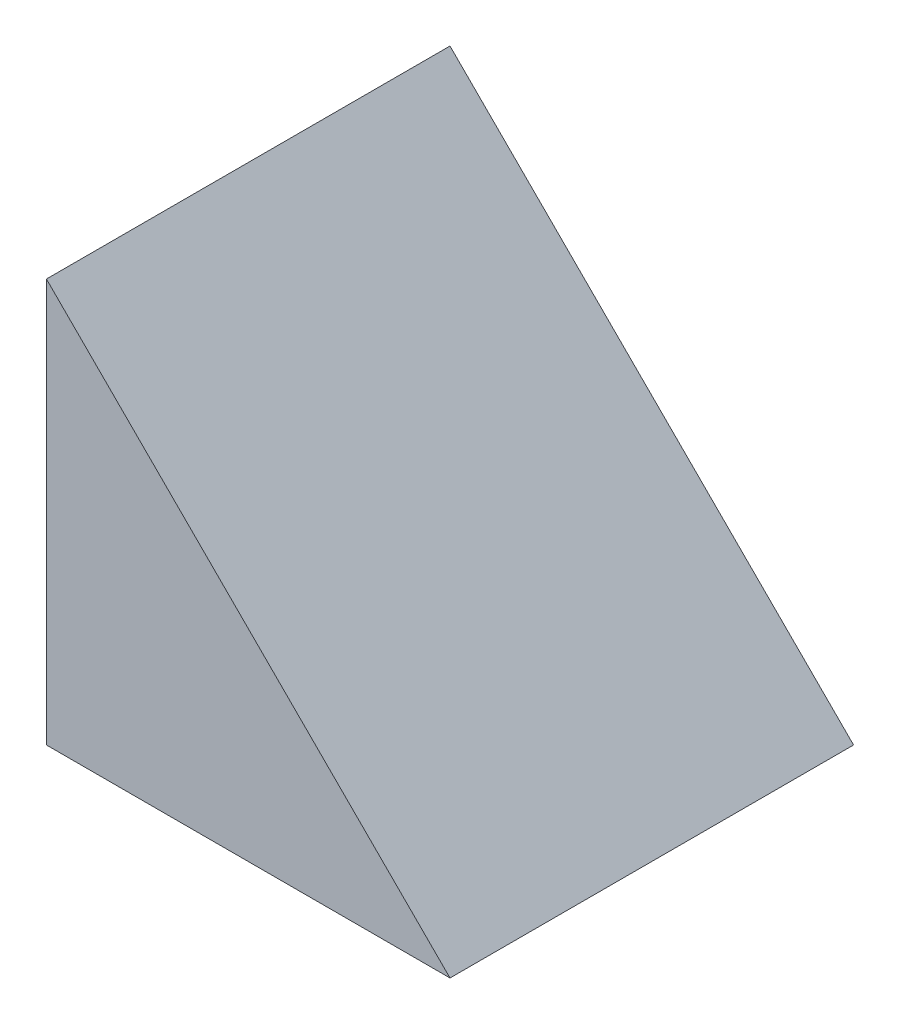
ISO-10303-21;
HEADER;
FILE_DESCRIPTION(('STEP AP214'),'2;1');
FILE_NAME('part.step','',(''),(''),'','','');
FILE_SCHEMA(('AUTOMOTIVE_DESIGN { 1 0 10303 214 1 1 1 1 }'));
ENDSEC;
DATA;
#1=APPLICATION_CONTEXT('core data for automotive mechanical design processes');
#2=APPLICATION_PROTOCOL_DEFINITION('international standard','automotive_design',2000,#1);
#3=PRODUCT_CONTEXT('',#1,'mechanical');
#4=PRODUCT('Part','Part','',(#3));
#5=PRODUCT_RELATED_PRODUCT_CATEGORY('part','',(#4));
#6=PRODUCT_DEFINITION_FORMATION('','',#4);
#7=PRODUCT_DEFINITION_CONTEXT('part definition',#1,'design');
#8=PRODUCT_DEFINITION('design','',#6,#7);
#9=PRODUCT_DEFINITION_SHAPE('','',#8);
#10=(LENGTH_UNIT() NAMED_UNIT(*) SI_UNIT(.MILLI.,.METRE.));
#11=(NAMED_UNIT(*) PLANE_ANGLE_UNIT() SI_UNIT($,.RADIAN.));
#12=(NAMED_UNIT(*) SI_UNIT($,.STERADIAN.) SOLID_ANGLE_UNIT());
#13=UNCERTAINTY_MEASURE_WITH_UNIT(LENGTH_MEASURE(1.E-05),#10,'distance_accuracy_value','');
#14=(GEOMETRIC_REPRESENTATION_CONTEXT(3) GLOBAL_UNCERTAINTY_ASSIGNED_CONTEXT((#13)) GLOBAL_UNIT_ASSIGNED_CONTEXT((#10,
#11,#12)) REPRESENTATION_CONTEXT('',''));
#15=CARTESIAN_POINT('',(0.,0.,0.));
#16=DIRECTION('',(0.,0.,1.));
#17=DIRECTION('',(1.,0.,0.));
#18=AXIS2_PLACEMENT_3D('',#15,#16,#17);
#19=CARTESIAN_POINT('',(15.,0.,15.));
#20=DIRECTION('',(0.,1.,0.));
#21=DIRECTION('',(0.,0.,1.));
#22=AXIS2_PLACEMENT_3D('',#19,#20,#21);
#23=PLANE('',#22);
#24=DIRECTION('',(1.,0.,0.));
#25=VECTOR('',#24,1.);
#26=CARTESIAN_POINT('',(15.,0.,0.));
#27=LINE('',#26,#25);
#28=CARTESIAN_POINT('',(0.,0.,0.));
#29=VERTEX_POINT('',#28);
#30=CARTESIAN_POINT('',(15.,0.,0.));
#31=VERTEX_POINT('',#30);
#32=EDGE_CURVE('E80',#29,#31,#27,.T.);
#33=ORIENTED_EDGE('',*,*,#32,.T.);
#34=DIRECTION('',(0.,0.,-1.));
#35=VECTOR('',#34,1.);
#36=CARTESIAN_POINT('',(15.,0.,15.));
#37=LINE('',#36,#35);
#38=CARTESIAN_POINT('',(15.,0.,15.));
#39=VERTEX_POINT('',#38);
#40=EDGE_CURVE('E11',#39,#31,#37,.T.);
#41=ORIENTED_EDGE('',*,*,#40,.F.);
#42=DIRECTION('',(1.,0.,0.));
#43=VECTOR('',#42,1.);
#44=CARTESIAN_POINT('',(15.,0.,15.));
#45=LINE('',#44,#43);
#46=CARTESIAN_POINT('',(0.,0.,15.));
#47=VERTEX_POINT('',#46);
#48=EDGE_CURVE('E73',#47,#39,#45,.T.);
#49=ORIENTED_EDGE('',*,*,#48,.F.);
#50=DIRECTION('',(0.,0.,-1.));
#51=VECTOR('',#50,1.);
#52=CARTESIAN_POINT('',(0.,0.,15.));
#53=LINE('',#52,#51);
#54=EDGE_CURVE('E81',#47,#29,#53,.T.);
#55=ORIENTED_EDGE('',*,*,#54,.T.);
#56=EDGE_LOOP('',(#33,#41,#49,#55));
#57=FACE_BOUND('',#56,.T.);
#58=ADVANCED_FACE('F33',(#57),#23,.F.);
#59=CARTESIAN_POINT('',(0.,15.,15.));
#60=DIRECTION('',(-0.707106781186547,-0.707106781186547,0.));
#61=DIRECTION('',(0.707106781186548,-0.707106781186548,0.));
#62=AXIS2_PLACEMENT_3D('',#59,#60,#61);
#63=PLANE('',#62);
#64=DIRECTION('',(-0.707106781186547,0.707106781186547,0.));
#65=VECTOR('',#64,1.);
#66=CARTESIAN_POINT('',(0.,15.,0.));
#67=LINE('',#66,#65);
#68=CARTESIAN_POINT('',(0.,15.,0.));
#69=VERTEX_POINT('',#68);
#70=EDGE_CURVE('E61',#31,#69,#67,.T.);
#71=ORIENTED_EDGE('',*,*,#70,.T.);
#72=DIRECTION('',(0.,0.,-1.));
#73=VECTOR('',#72,1.);
#74=CARTESIAN_POINT('',(0.,15.,15.));
#75=LINE('',#74,#73);
#76=CARTESIAN_POINT('',(0.,15.,15.));
#77=VERTEX_POINT('',#76);
#78=EDGE_CURVE('E41',#77,#69,#75,.T.);
#79=ORIENTED_EDGE('',*,*,#78,.F.);
#80=DIRECTION('',(-0.707106781186547,0.707106781186547,0.));
#81=VECTOR('',#80,1.);
#82=CARTESIAN_POINT('',(0.,15.,15.));
#83=LINE('',#82,#81);
#84=EDGE_CURVE('E69',#39,#77,#83,.T.);
#85=ORIENTED_EDGE('',*,*,#84,.F.);
#86=ORIENTED_EDGE('',*,*,#40,.T.);
#87=EDGE_LOOP('',(#71,#79,#85,#86));
#88=FACE_BOUND('',#87,.T.);
#89=ADVANCED_FACE('F70',(#88),#63,.F.);
#90=CARTESIAN_POINT('',(0.,0.,15.));
#91=DIRECTION('',(1.,0.,0.));
#92=DIRECTION('',(0.,0.,-1.));
#93=AXIS2_PLACEMENT_3D('',#90,#91,#92);
#94=PLANE('',#93);
#95=DIRECTION('',(0.,-1.,0.));
#96=VECTOR('',#95,1.);
#97=CARTESIAN_POINT('',(0.,0.,0.));
#98=LINE('',#97,#96);
#99=EDGE_CURVE('E66',#69,#29,#98,.T.);
#100=ORIENTED_EDGE('',*,*,#99,.T.);
#101=ORIENTED_EDGE('',*,*,#54,.F.);
#102=DIRECTION('',(0.,-1.,0.));
#103=VECTOR('',#102,1.);
#104=CARTESIAN_POINT('',(0.,0.,15.));
#105=LINE('',#104,#103);
#106=EDGE_CURVE('E49',#77,#47,#105,.T.);
#107=ORIENTED_EDGE('',*,*,#106,.F.);
#108=ORIENTED_EDGE('',*,*,#78,.T.);
#109=EDGE_LOOP('',(#100,#101,#107,#108));
#110=FACE_BOUND('',#109,.T.);
#111=ADVANCED_FACE('F88',(#110),#94,.F.);
#112=CARTESIAN_POINT('',(0.,0.,15.));
#113=DIRECTION('',(0.,0.,-1.));
#114=DIRECTION('',(-1.,0.,0.));
#115=AXIS2_PLACEMENT_3D('',#112,#113,#114);
#116=PLANE('',#115);
#117=ORIENTED_EDGE('',*,*,#48,.T.);
#118=ORIENTED_EDGE('',*,*,#84,.T.);
#119=ORIENTED_EDGE('',*,*,#106,.T.);
#120=EDGE_LOOP('',(#117,#118,#119));
#121=FACE_BOUND('',#120,.T.);
#122=ADVANCED_FACE('F76',(#121),#116,.F.);
#123=CARTESIAN_POINT('',(0.,0.,0.));
#124=DIRECTION('',(0.,0.,-1.));
#125=DIRECTION('',(-1.,0.,0.));
#126=AXIS2_PLACEMENT_3D('',#123,#124,#125);
#127=PLANE('',#126);
#128=ORIENTED_EDGE('',*,*,#32,.F.);
#129=ORIENTED_EDGE('',*,*,#99,.F.);
#130=ORIENTED_EDGE('',*,*,#70,.F.);
#131=EDGE_LOOP('',(#128,#129,#130));
#132=FACE_BOUND('',#131,.T.);
#133=ADVANCED_FACE('F89',(#132),#127,.T.);
#134=CLOSED_SHELL('',(#58,#89,#111,#122,#133));
#135=MANIFOLD_SOLID_BREP('B2',#134);
#136=ADVANCED_BREP_SHAPE_REPRESENTATION('',(#18,#135),#14);
#137=SHAPE_DEFINITION_REPRESENTATION(#9,#136);
ENDSEC;
END-ISO-10303-21;
